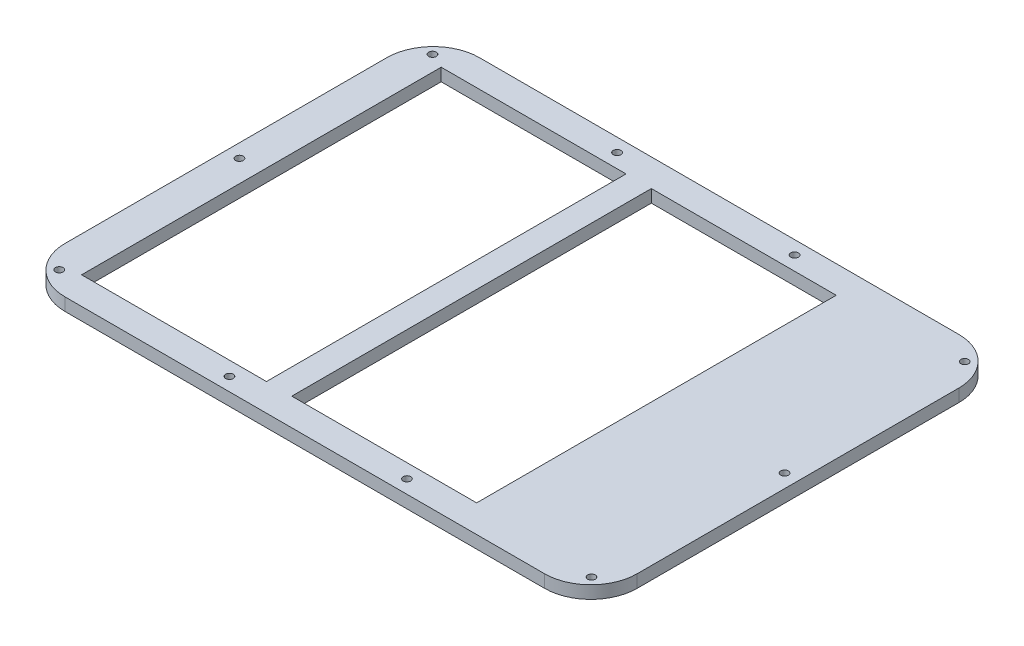
ISO-10303-21;
HEADER;
FILE_DESCRIPTION(('STEP AP214'),'2;1');
FILE_NAME('part.step','',(''),(''),'','','');
FILE_SCHEMA(('AUTOMOTIVE_DESIGN { 1 0 10303 214 1 1 1 1 }'));
ENDSEC;
DATA;
#1=APPLICATION_CONTEXT('core data for automotive mechanical design processes');
#2=APPLICATION_PROTOCOL_DEFINITION('international standard','automotive_design',2000,#1);
#3=PRODUCT_CONTEXT('',#1,'mechanical');
#4=PRODUCT('Part','Part','',(#3));
#5=PRODUCT_RELATED_PRODUCT_CATEGORY('part','',(#4));
#6=PRODUCT_DEFINITION_FORMATION('','',#4);
#7=PRODUCT_DEFINITION_CONTEXT('part definition',#1,'design');
#8=PRODUCT_DEFINITION('design','',#6,#7);
#9=PRODUCT_DEFINITION_SHAPE('','',#8);
#10=(LENGTH_UNIT() NAMED_UNIT(*) SI_UNIT(.MILLI.,.METRE.));
#11=(NAMED_UNIT(*) PLANE_ANGLE_UNIT() SI_UNIT($,.RADIAN.));
#12=(NAMED_UNIT(*) SI_UNIT($,.STERADIAN.) SOLID_ANGLE_UNIT());
#13=UNCERTAINTY_MEASURE_WITH_UNIT(LENGTH_MEASURE(1.E-05),#10,'distance_accuracy_value','');
#14=(GEOMETRIC_REPRESENTATION_CONTEXT(3) GLOBAL_UNCERTAINTY_ASSIGNED_CONTEXT((#13)) GLOBAL_UNIT_ASSIGNED_CONTEXT((#10,
#11,#12)) REPRESENTATION_CONTEXT('',''));
#15=CARTESIAN_POINT('',(0.,0.,0.));
#16=DIRECTION('',(0.,0.,1.));
#17=DIRECTION('',(1.,0.,0.));
#18=AXIS2_PLACEMENT_3D('',#15,#16,#17);
#19=CARTESIAN_POINT('',(0.,5.,0.));
#20=DIRECTION('',(0.,-1.,0.));
#21=DIRECTION('',(0.,0.,-1.));
#22=AXIS2_PLACEMENT_3D('',#19,#20,#21);
#23=PLANE('',#22);
#24=DIRECTION('',(0.,0.,1.));
#25=VECTOR('',#24,1.);
#26=CARTESIAN_POINT('',(-98.97031,5.,71.));
#27=LINE('',#26,#25);
#28=CARTESIAN_POINT('',(-98.97031,5.,-71.));
#29=VERTEX_POINT('',#28);
#30=CARTESIAN_POINT('',(-98.97031,5.,71.));
#31=VERTEX_POINT('',#30);
#32=EDGE_CURVE('E194',#29,#31,#27,.T.);
#33=ORIENTED_EDGE('',*,*,#32,.F.);
#34=DIRECTION('',(-1.,0.,0.));
#35=VECTOR('',#34,1.);
#36=CARTESIAN_POINT('',(-98.97031,5.,-71.));
#37=LINE('',#36,#35);
#38=CARTESIAN_POINT('',(-25.97031,5.,-71.));
#39=VERTEX_POINT('',#38);
#40=EDGE_CURVE('E202',#39,#29,#37,.T.);
#41=ORIENTED_EDGE('',*,*,#40,.F.);
#42=DIRECTION('',(0.,0.,-1.));
#43=VECTOR('',#42,1.);
#44=CARTESIAN_POINT('',(-25.97031,5.,-71.));
#45=LINE('',#44,#43);
#46=CARTESIAN_POINT('',(-25.97031,5.,71.));
#47=VERTEX_POINT('',#46);
#48=EDGE_CURVE('E199',#47,#39,#45,.T.);
#49=ORIENTED_EDGE('',*,*,#48,.F.);
#50=DIRECTION('',(1.,0.,0.));
#51=VECTOR('',#50,1.);
#52=CARTESIAN_POINT('',(-25.97031,5.,71.));
#53=LINE('',#52,#51);
#54=EDGE_CURVE('E196',#31,#47,#53,.T.);
#55=ORIENTED_EDGE('',*,*,#54,.F.);
#56=EDGE_LOOP('',(#33,#41,#49,#55));
#57=FACE_BOUND('',#56,.T.);
#58=DIRECTION('',(1.,0.,0.));
#59=VECTOR('',#58,1.);
#60=CARTESIAN_POINT('',(112.97031,5.,81.8261));
#61=LINE('',#60,#59);
#62=CARTESIAN_POINT('',(-94.67031,5.,81.8261));
#63=VERTEX_POINT('',#62);
#64=CARTESIAN_POINT('',(94.67031,5.,81.8261));
#65=VERTEX_POINT('',#64);
#66=EDGE_CURVE('E288',#63,#65,#61,.T.);
#67=ORIENTED_EDGE('',*,*,#66,.T.);
#68=CARTESIAN_POINT('',(94.67031,5.,63.5261));
#69=DIRECTION('',(0.,-1.,0.));
#70=DIRECTION('',(0.,0.,-1.));
#71=AXIS2_PLACEMENT_3D('',#68,#69,#70);
#72=CIRCLE('',#71,18.3);
#73=CARTESIAN_POINT('',(112.97031,5.,63.5261));
#74=VERTEX_POINT('',#73);
#75=EDGE_CURVE('E328',#65,#74,#72,.F.);
#76=ORIENTED_EDGE('',*,*,#75,.T.);
#77=DIRECTION('',(0.,0.,-1.));
#78=VECTOR('',#77,1.);
#79=CARTESIAN_POINT('',(112.97031,5.,-81.8261));
#80=LINE('',#79,#78);
#81=CARTESIAN_POINT('',(112.97031,5.,-63.5261));
#82=VERTEX_POINT('',#81);
#83=EDGE_CURVE('E292',#74,#82,#80,.T.);
#84=ORIENTED_EDGE('',*,*,#83,.T.);
#85=CARTESIAN_POINT('',(94.67031,5.,-63.5261));
#86=DIRECTION('',(0.,-1.,0.));
#87=DIRECTION('',(0.,0.,-1.));
#88=AXIS2_PLACEMENT_3D('',#85,#86,#87);
#89=CIRCLE('',#88,18.3);
#90=CARTESIAN_POINT('',(94.67031,5.,-81.8261));
#91=VERTEX_POINT('',#90);
#92=EDGE_CURVE('E59',#82,#91,#89,.F.);
#93=ORIENTED_EDGE('',*,*,#92,.T.);
#94=DIRECTION('',(-1.,0.,0.));
#95=VECTOR('',#94,1.);
#96=CARTESIAN_POINT('',(-112.97031,5.,-81.8261));
#97=LINE('',#96,#95);
#98=CARTESIAN_POINT('',(-94.67031,5.,-81.8261));
#99=VERTEX_POINT('',#98);
#100=EDGE_CURVE('E294',#91,#99,#97,.T.);
#101=ORIENTED_EDGE('',*,*,#100,.T.);
#102=CARTESIAN_POINT('',(-94.67031,5.,-63.5261));
#103=DIRECTION('',(0.,-1.,0.));
#104=DIRECTION('',(0.,0.,-1.));
#105=AXIS2_PLACEMENT_3D('',#102,#103,#104);
#106=CIRCLE('',#105,18.3);
#107=CARTESIAN_POINT('',(-112.97031,5.,-63.5261));
#108=VERTEX_POINT('',#107);
#109=EDGE_CURVE('E324',#99,#108,#106,.F.);
#110=ORIENTED_EDGE('',*,*,#109,.T.);
#111=DIRECTION('',(0.,0.,1.));
#112=VECTOR('',#111,1.);
#113=CARTESIAN_POINT('',(-112.97031,5.,81.8261));
#114=LINE('',#113,#112);
#115=CARTESIAN_POINT('',(-112.97031,5.,63.5261));
#116=VERTEX_POINT('',#115);
#117=EDGE_CURVE('E285',#108,#116,#114,.T.);
#118=ORIENTED_EDGE('',*,*,#117,.T.);
#119=CARTESIAN_POINT('',(-94.67031,5.,63.5261));
#120=DIRECTION('',(0.,-1.,0.));
#121=DIRECTION('',(0.,0.,-1.));
#122=AXIS2_PLACEMENT_3D('',#119,#120,#121);
#123=CIRCLE('',#122,18.3);
#124=EDGE_CURVE('E326',#116,#63,#123,.F.);
#125=ORIENTED_EDGE('',*,*,#124,.T.);
#126=EDGE_LOOP('',(#67,#76,#84,#93,#101,#110,#118,#125));
#127=FACE_BOUND('',#126,.T.);
#128=CARTESIAN_POINT('',(107.63631,5.,0.));
#129=DIRECTION('',(0.,1.,0.));
#130=DIRECTION('',(0.,0.,-1.));
#131=AXIS2_PLACEMENT_3D('',#128,#129,#130);
#132=CIRCLE('',#131,1.5);
#133=CARTESIAN_POINT('',(107.63631,5.,-1.50000000000008));
#134=VERTEX_POINT('',#133);
#135=EDGE_CURVE('E279',#134,#134,#132,.T.);
#136=ORIENTED_EDGE('',*,*,#135,.F.);
#137=EDGE_LOOP('',(#136));
#138=FACE_BOUND('',#137,.T.);
#139=CARTESIAN_POINT('',(35.04311,5.,-76.5429));
#140=DIRECTION('',(0.,1.,0.));
#141=DIRECTION('',(0.,0.,-1.));
#142=AXIS2_PLACEMENT_3D('',#139,#140,#141);
#143=CIRCLE('',#142,1.5);
#144=CARTESIAN_POINT('',(35.04311,5.,-78.0429));
#145=VERTEX_POINT('',#144);
#146=EDGE_CURVE('E273',#145,#145,#143,.T.);
#147=ORIENTED_EDGE('',*,*,#146,.F.);
#148=EDGE_LOOP('',(#147));
#149=FACE_BOUND('',#148,.T.);
#150=CARTESIAN_POINT('',(-105.09631,5.,-73.6981));
#151=DIRECTION('',(0.,1.,0.));
#152=DIRECTION('',(0.,0.,1.));
#153=AXIS2_PLACEMENT_3D('',#150,#151,#152);
#154=CIRCLE('',#153,1.5);
#155=CARTESIAN_POINT('',(-105.09631,5.,-72.1981));
#156=VERTEX_POINT('',#155);
#157=EDGE_CURVE('E267',#156,#156,#154,.T.);
#158=ORIENTED_EDGE('',*,*,#157,.F.);
#159=EDGE_LOOP('',(#158));
#160=FACE_BOUND('',#159,.T.);
#161=CARTESIAN_POINT('',(-35.04311,5.,-76.5429));
#162=DIRECTION('',(0.,1.,0.));
#163=DIRECTION('',(0.,0.,1.));
#164=AXIS2_PLACEMENT_3D('',#161,#162,#163);
#165=CIRCLE('',#164,1.5);
#166=CARTESIAN_POINT('',(-35.04311,5.,-75.0429));
#167=VERTEX_POINT('',#166);
#168=EDGE_CURVE('E261',#167,#167,#165,.T.);
#169=ORIENTED_EDGE('',*,*,#168,.F.);
#170=EDGE_LOOP('',(#169));
#171=FACE_BOUND('',#170,.T.);
#172=CARTESIAN_POINT('',(105.09631,5.,-73.6981));
#173=DIRECTION('',(0.,1.,0.));
#174=DIRECTION('',(0.,0.,-1.));
#175=AXIS2_PLACEMENT_3D('',#172,#173,#174);
#176=CIRCLE('',#175,1.49999999999999);
#177=CARTESIAN_POINT('',(105.09631,5.,-75.1981));
#178=VERTEX_POINT('',#177);
#179=EDGE_CURVE('E255',#178,#178,#176,.T.);
#180=ORIENTED_EDGE('',*,*,#179,.F.);
#181=EDGE_LOOP('',(#180));
#182=FACE_BOUND('',#181,.T.);
#183=CARTESIAN_POINT('',(105.09631,5.,73.6981));
#184=DIRECTION('',(0.,1.,0.));
#185=DIRECTION('',(0.,0.,1.));
#186=AXIS2_PLACEMENT_3D('',#183,#184,#185);
#187=CIRCLE('',#186,1.49999999999999);
#188=CARTESIAN_POINT('',(105.09631,5.,75.1981));
#189=VERTEX_POINT('',#188);
#190=EDGE_CURVE('E249',#189,#189,#187,.T.);
#191=ORIENTED_EDGE('',*,*,#190,.F.);
#192=EDGE_LOOP('',(#191));
#193=FACE_BOUND('',#192,.T.);
#194=CARTESIAN_POINT('',(35.04311,5.,76.5429));
#195=DIRECTION('',(0.,1.,0.));
#196=DIRECTION('',(0.,0.,1.));
#197=AXIS2_PLACEMENT_3D('',#194,#195,#196);
#198=CIRCLE('',#197,1.5);
#199=CARTESIAN_POINT('',(35.04311,5.,78.0429));
#200=VERTEX_POINT('',#199);
#201=EDGE_CURVE('E243',#200,#200,#198,.T.);
#202=ORIENTED_EDGE('',*,*,#201,.F.);
#203=EDGE_LOOP('',(#202));
#204=FACE_BOUND('',#203,.T.);
#205=CARTESIAN_POINT('',(-107.63631,5.,0.));
#206=DIRECTION('',(0.,1.,0.));
#207=DIRECTION('',(0.,0.,1.));
#208=AXIS2_PLACEMENT_3D('',#205,#206,#207);
#209=CIRCLE('',#208,1.5);
#210=CARTESIAN_POINT('',(-107.63631,5.,1.5));
#211=VERTEX_POINT('',#210);
#212=EDGE_CURVE('E237',#211,#211,#209,.T.);
#213=ORIENTED_EDGE('',*,*,#212,.F.);
#214=EDGE_LOOP('',(#213));
#215=FACE_BOUND('',#214,.T.);
#216=CARTESIAN_POINT('',(-35.04311,5.,76.5429));
#217=DIRECTION('',(0.,1.,0.));
#218=DIRECTION('',(0.,0.,-1.));
#219=AXIS2_PLACEMENT_3D('',#216,#217,#218);
#220=CIRCLE('',#219,1.5);
#221=CARTESIAN_POINT('',(-35.04311,5.,75.0429));
#222=VERTEX_POINT('',#221);
#223=EDGE_CURVE('E231',#222,#222,#220,.T.);
#224=ORIENTED_EDGE('',*,*,#223,.F.);
#225=EDGE_LOOP('',(#224));
#226=FACE_BOUND('',#225,.T.);
#227=CARTESIAN_POINT('',(-105.09631,5.,73.6981000000001));
#228=DIRECTION('',(0.,1.,0.));
#229=DIRECTION('',(0.,0.,-1.));
#230=AXIS2_PLACEMENT_3D('',#227,#228,#229);
#231=CIRCLE('',#230,1.5);
#232=CARTESIAN_POINT('',(-105.09631,5.,72.1981000000001));
#233=VERTEX_POINT('',#232);
#234=EDGE_CURVE('E225',#233,#233,#231,.T.);
#235=ORIENTED_EDGE('',*,*,#234,.F.);
#236=EDGE_LOOP('',(#235));
#237=FACE_BOUND('',#236,.T.);
#238=DIRECTION('',(-1.,0.,0.));
#239=VECTOR('',#238,1.);
#240=CARTESIAN_POINT('',(-15.97031,5.,-71.));
#241=LINE('',#240,#239);
#242=CARTESIAN_POINT('',(57.02969,5.,-71.));
#243=VERTEX_POINT('',#242);
#244=CARTESIAN_POINT('',(-15.97031,5.,-71.));
#245=VERTEX_POINT('',#244);
#246=EDGE_CURVE('E153',#243,#245,#241,.T.);
#247=ORIENTED_EDGE('',*,*,#246,.F.);
#248=DIRECTION('',(0.,0.,-1.));
#249=VECTOR('',#248,1.);
#250=CARTESIAN_POINT('',(57.02969,5.,-71.));
#251=LINE('',#250,#249);
#252=CARTESIAN_POINT('',(57.02969,5.,71.));
#253=VERTEX_POINT('',#252);
#254=EDGE_CURVE('E178',#253,#243,#251,.T.);
#255=ORIENTED_EDGE('',*,*,#254,.F.);
#256=DIRECTION('',(1.,0.,0.));
#257=VECTOR('',#256,1.);
#258=CARTESIAN_POINT('',(57.02969,5.,71.));
#259=LINE('',#258,#257);
#260=CARTESIAN_POINT('',(-15.97031,5.,71.));
#261=VERTEX_POINT('',#260);
#262=EDGE_CURVE('E176',#261,#253,#259,.T.);
#263=ORIENTED_EDGE('',*,*,#262,.F.);
#264=DIRECTION('',(0.,0.,1.));
#265=VECTOR('',#264,1.);
#266=CARTESIAN_POINT('',(-15.97031,5.,71.));
#267=LINE('',#266,#265);
#268=EDGE_CURVE('E163',#245,#261,#267,.T.);
#269=ORIENTED_EDGE('',*,*,#268,.F.);
#270=EDGE_LOOP('',(#247,#255,#263,#269));
#271=FACE_BOUND('',#270,.T.);
#272=ADVANCED_FACE('F39',(#57,#127,#138,#149,#160,#171,#182,#193,#204,#215,#226,#237,#271),#23,.F.);
#273=CARTESIAN_POINT('',(0.,0.,0.));
#274=DIRECTION('',(0.,-1.,0.));
#275=DIRECTION('',(0.,0.,-1.));
#276=AXIS2_PLACEMENT_3D('',#273,#274,#275);
#277=PLANE('',#276);
#278=CARTESIAN_POINT('',(-35.04311,0.,76.5429));
#279=DIRECTION('',(0.,1.,0.));
#280=DIRECTION('',(0.,0.,-1.));
#281=AXIS2_PLACEMENT_3D('',#278,#279,#280);
#282=CIRCLE('',#281,1.5);
#283=CARTESIAN_POINT('',(-35.04311,0.,75.0429));
#284=VERTEX_POINT('',#283);
#285=EDGE_CURVE('E228',#284,#284,#282,.T.);
#286=ORIENTED_EDGE('',*,*,#285,.T.);
#287=EDGE_LOOP('',(#286));
#288=FACE_BOUND('',#287,.T.);
#289=CARTESIAN_POINT('',(35.04311,0.,76.5429));
#290=DIRECTION('',(0.,1.,0.));
#291=DIRECTION('',(0.,0.,1.));
#292=AXIS2_PLACEMENT_3D('',#289,#290,#291);
#293=CIRCLE('',#292,1.5);
#294=CARTESIAN_POINT('',(35.04311,0.,78.0429));
#295=VERTEX_POINT('',#294);
#296=EDGE_CURVE('E240',#295,#295,#293,.T.);
#297=ORIENTED_EDGE('',*,*,#296,.T.);
#298=EDGE_LOOP('',(#297));
#299=FACE_BOUND('',#298,.T.);
#300=CARTESIAN_POINT('',(105.09631,0.,-73.6981));
#301=DIRECTION('',(0.,1.,0.));
#302=DIRECTION('',(0.,0.,-1.));
#303=AXIS2_PLACEMENT_3D('',#300,#301,#302);
#304=CIRCLE('',#303,1.49999999999999);
#305=CARTESIAN_POINT('',(105.09631,0.,-75.1981));
#306=VERTEX_POINT('',#305);
#307=EDGE_CURVE('E252',#306,#306,#304,.T.);
#308=ORIENTED_EDGE('',*,*,#307,.T.);
#309=EDGE_LOOP('',(#308));
#310=FACE_BOUND('',#309,.T.);
#311=CARTESIAN_POINT('',(-105.09631,0.,-73.6981));
#312=DIRECTION('',(0.,1.,0.));
#313=DIRECTION('',(0.,0.,1.));
#314=AXIS2_PLACEMENT_3D('',#311,#312,#313);
#315=CIRCLE('',#314,1.5);
#316=CARTESIAN_POINT('',(-105.09631,0.,-72.1981));
#317=VERTEX_POINT('',#316);
#318=EDGE_CURVE('E264',#317,#317,#315,.T.);
#319=ORIENTED_EDGE('',*,*,#318,.T.);
#320=EDGE_LOOP('',(#319));
#321=FACE_BOUND('',#320,.T.);
#322=CARTESIAN_POINT('',(107.63631,0.,0.));
#323=DIRECTION('',(0.,1.,0.));
#324=DIRECTION('',(0.,0.,-1.));
#325=AXIS2_PLACEMENT_3D('',#322,#323,#324);
#326=CIRCLE('',#325,1.5);
#327=CARTESIAN_POINT('',(107.63631,0.,-1.50000000000008));
#328=VERTEX_POINT('',#327);
#329=EDGE_CURVE('E276',#328,#328,#326,.T.);
#330=ORIENTED_EDGE('',*,*,#329,.T.);
#331=EDGE_LOOP('',(#330));
#332=FACE_BOUND('',#331,.T.);
#333=DIRECTION('',(0.,0.,-1.));
#334=VECTOR('',#333,1.);
#335=CARTESIAN_POINT('',(112.97031,0.,-81.8261));
#336=LINE('',#335,#334);
#337=CARTESIAN_POINT('',(112.97031,0.,63.5261));
#338=VERTEX_POINT('',#337);
#339=CARTESIAN_POINT('',(112.97031,0.,-63.5261));
#340=VERTEX_POINT('',#339);
#341=EDGE_CURVE('E302',#338,#340,#336,.T.);
#342=ORIENTED_EDGE('',*,*,#341,.F.);
#343=CARTESIAN_POINT('',(94.67031,0.,63.5261));
#344=DIRECTION('',(0.,-1.,0.));
#345=DIRECTION('',(0.,0.,-1.));
#346=AXIS2_PLACEMENT_3D('',#343,#344,#345);
#347=CIRCLE('',#346,18.3);
#348=CARTESIAN_POINT('',(94.67031,0.,81.8261));
#349=VERTEX_POINT('',#348);
#350=EDGE_CURVE('E316',#338,#349,#347,.T.);
#351=ORIENTED_EDGE('',*,*,#350,.T.);
#352=DIRECTION('',(1.,0.,0.));
#353=VECTOR('',#352,1.);
#354=CARTESIAN_POINT('',(112.97031,0.,81.8261));
#355=LINE('',#354,#353);
#356=CARTESIAN_POINT('',(-94.67031,0.,81.8261));
#357=VERTEX_POINT('',#356);
#358=EDGE_CURVE('E299',#357,#349,#355,.T.);
#359=ORIENTED_EDGE('',*,*,#358,.F.);
#360=CARTESIAN_POINT('',(-94.67031,0.,63.5261));
#361=DIRECTION('',(0.,-1.,0.));
#362=DIRECTION('',(0.,0.,-1.));
#363=AXIS2_PLACEMENT_3D('',#360,#361,#362);
#364=CIRCLE('',#363,18.3);
#365=CARTESIAN_POINT('',(-112.97031,0.,63.5261));
#366=VERTEX_POINT('',#365);
#367=EDGE_CURVE('E314',#357,#366,#364,.T.);
#368=ORIENTED_EDGE('',*,*,#367,.T.);
#369=DIRECTION('',(0.,0.,1.));
#370=VECTOR('',#369,1.);
#371=CARTESIAN_POINT('',(-112.97031,0.,81.8261));
#372=LINE('',#371,#370);
#373=CARTESIAN_POINT('',(-112.97031,0.,-63.5261));
#374=VERTEX_POINT('',#373);
#375=EDGE_CURVE('E282',#374,#366,#372,.T.);
#376=ORIENTED_EDGE('',*,*,#375,.F.);
#377=CARTESIAN_POINT('',(-94.67031,0.,-63.5261));
#378=DIRECTION('',(0.,-1.,0.));
#379=DIRECTION('',(0.,0.,-1.));
#380=AXIS2_PLACEMENT_3D('',#377,#378,#379);
#381=CIRCLE('',#380,18.3);
#382=CARTESIAN_POINT('',(-94.67031,0.,-81.8261));
#383=VERTEX_POINT('',#382);
#384=EDGE_CURVE('E312',#374,#383,#381,.T.);
#385=ORIENTED_EDGE('',*,*,#384,.T.);
#386=DIRECTION('',(-1.,0.,0.));
#387=VECTOR('',#386,1.);
#388=CARTESIAN_POINT('',(-112.97031,0.,-81.8261));
#389=LINE('',#388,#387);
#390=CARTESIAN_POINT('',(94.67031,0.,-81.8261));
#391=VERTEX_POINT('',#390);
#392=EDGE_CURVE('E289',#391,#383,#389,.T.);
#393=ORIENTED_EDGE('',*,*,#392,.F.);
#394=CARTESIAN_POINT('',(94.67031,0.,-63.5261));
#395=DIRECTION('',(0.,-1.,0.));
#396=DIRECTION('',(0.,0.,-1.));
#397=AXIS2_PLACEMENT_3D('',#394,#395,#396);
#398=CIRCLE('',#397,18.3);
#399=EDGE_CURVE('E310',#391,#340,#398,.T.);
#400=ORIENTED_EDGE('',*,*,#399,.T.);
#401=EDGE_LOOP('',(#342,#351,#359,#368,#376,#385,#393,#400));
#402=FACE_BOUND('',#401,.T.);
#403=CARTESIAN_POINT('',(35.04311,0.,-76.5429));
#404=DIRECTION('',(0.,1.,0.));
#405=DIRECTION('',(0.,0.,-1.));
#406=AXIS2_PLACEMENT_3D('',#403,#404,#405);
#407=CIRCLE('',#406,1.5);
#408=CARTESIAN_POINT('',(35.04311,0.,-78.0429));
#409=VERTEX_POINT('',#408);
#410=EDGE_CURVE('E270',#409,#409,#407,.T.);
#411=ORIENTED_EDGE('',*,*,#410,.T.);
#412=EDGE_LOOP('',(#411));
#413=FACE_BOUND('',#412,.T.);
#414=CARTESIAN_POINT('',(-35.04311,0.,-76.5429));
#415=DIRECTION('',(0.,1.,0.));
#416=DIRECTION('',(0.,0.,1.));
#417=AXIS2_PLACEMENT_3D('',#414,#415,#416);
#418=CIRCLE('',#417,1.5);
#419=CARTESIAN_POINT('',(-35.04311,0.,-75.0429));
#420=VERTEX_POINT('',#419);
#421=EDGE_CURVE('E258',#420,#420,#418,.T.);
#422=ORIENTED_EDGE('',*,*,#421,.T.);
#423=EDGE_LOOP('',(#422));
#424=FACE_BOUND('',#423,.T.);
#425=CARTESIAN_POINT('',(105.09631,0.,73.6981));
#426=DIRECTION('',(0.,1.,0.));
#427=DIRECTION('',(0.,0.,1.));
#428=AXIS2_PLACEMENT_3D('',#425,#426,#427);
#429=CIRCLE('',#428,1.49999999999999);
#430=CARTESIAN_POINT('',(105.09631,0.,75.1981));
#431=VERTEX_POINT('',#430);
#432=EDGE_CURVE('E246',#431,#431,#429,.T.);
#433=ORIENTED_EDGE('',*,*,#432,.T.);
#434=EDGE_LOOP('',(#433));
#435=FACE_BOUND('',#434,.T.);
#436=CARTESIAN_POINT('',(-107.63631,0.,0.));
#437=DIRECTION('',(0.,1.,0.));
#438=DIRECTION('',(0.,0.,1.));
#439=AXIS2_PLACEMENT_3D('',#436,#437,#438);
#440=CIRCLE('',#439,1.5);
#441=CARTESIAN_POINT('',(-107.63631,0.,1.5));
#442=VERTEX_POINT('',#441);
#443=EDGE_CURVE('E234',#442,#442,#440,.T.);
#444=ORIENTED_EDGE('',*,*,#443,.T.);
#445=EDGE_LOOP('',(#444));
#446=FACE_BOUND('',#445,.T.);
#447=CARTESIAN_POINT('',(-105.09631,0.,73.6981000000001));
#448=DIRECTION('',(0.,1.,0.));
#449=DIRECTION('',(0.,0.,-1.));
#450=AXIS2_PLACEMENT_3D('',#447,#448,#449);
#451=CIRCLE('',#450,1.5);
#452=CARTESIAN_POINT('',(-105.09631,0.,72.1981000000001));
#453=VERTEX_POINT('',#452);
#454=EDGE_CURVE('E224',#453,#453,#451,.T.);
#455=ORIENTED_EDGE('',*,*,#454,.T.);
#456=EDGE_LOOP('',(#455));
#457=FACE_BOUND('',#456,.T.);
#458=DIRECTION('',(-1.,0.,0.));
#459=VECTOR('',#458,1.);
#460=CARTESIAN_POINT('',(-98.97031,0.,-71.));
#461=LINE('',#460,#459);
#462=CARTESIAN_POINT('',(-25.97031,0.,-71.));
#463=VERTEX_POINT('',#462);
#464=CARTESIAN_POINT('',(-98.97031,0.,-71.));
#465=VERTEX_POINT('',#464);
#466=EDGE_CURVE('E197',#463,#465,#461,.T.);
#467=ORIENTED_EDGE('',*,*,#466,.T.);
#468=DIRECTION('',(0.,0.,1.));
#469=VECTOR('',#468,1.);
#470=CARTESIAN_POINT('',(-98.97031,0.,71.));
#471=LINE('',#470,#469);
#472=CARTESIAN_POINT('',(-98.97031,0.,71.));
#473=VERTEX_POINT('',#472);
#474=EDGE_CURVE('E171',#465,#473,#471,.T.);
#475=ORIENTED_EDGE('',*,*,#474,.T.);
#476=DIRECTION('',(1.,0.,0.));
#477=VECTOR('',#476,1.);
#478=CARTESIAN_POINT('',(-25.97031,0.,71.));
#479=LINE('',#478,#477);
#480=CARTESIAN_POINT('',(-25.97031,0.,71.));
#481=VERTEX_POINT('',#480);
#482=EDGE_CURVE('E207',#473,#481,#479,.T.);
#483=ORIENTED_EDGE('',*,*,#482,.T.);
#484=DIRECTION('',(0.,0.,-1.));
#485=VECTOR('',#484,1.);
#486=CARTESIAN_POINT('',(-25.97031,0.,-71.));
#487=LINE('',#486,#485);
#488=EDGE_CURVE('E210',#481,#463,#487,.T.);
#489=ORIENTED_EDGE('',*,*,#488,.T.);
#490=EDGE_LOOP('',(#467,#475,#483,#489));
#491=FACE_BOUND('',#490,.T.);
#492=DIRECTION('',(0.,0.,-1.));
#493=VECTOR('',#492,1.);
#494=CARTESIAN_POINT('',(57.02969,0.,-71.));
#495=LINE('',#494,#493);
#496=CARTESIAN_POINT('',(57.02969,0.,71.));
#497=VERTEX_POINT('',#496);
#498=CARTESIAN_POINT('',(57.02969,0.,-71.));
#499=VERTEX_POINT('',#498);
#500=EDGE_CURVE('E164',#497,#499,#495,.T.);
#501=ORIENTED_EDGE('',*,*,#500,.T.);
#502=DIRECTION('',(-1.,0.,0.));
#503=VECTOR('',#502,1.);
#504=CARTESIAN_POINT('',(-15.97031,0.,-71.));
#505=LINE('',#504,#503);
#506=CARTESIAN_POINT('',(-15.97031,0.,-71.));
#507=VERTEX_POINT('',#506);
#508=EDGE_CURVE('E182',#499,#507,#505,.T.);
#509=ORIENTED_EDGE('',*,*,#508,.T.);
#510=DIRECTION('',(0.,0.,1.));
#511=VECTOR('',#510,1.);
#512=CARTESIAN_POINT('',(-15.97031,0.,71.));
#513=LINE('',#512,#511);
#514=CARTESIAN_POINT('',(-15.97031,0.,71.));
#515=VERTEX_POINT('',#514);
#516=EDGE_CURVE('E170',#507,#515,#513,.T.);
#517=ORIENTED_EDGE('',*,*,#516,.T.);
#518=DIRECTION('',(1.,0.,0.));
#519=VECTOR('',#518,1.);
#520=CARTESIAN_POINT('',(57.02969,0.,71.));
#521=LINE('',#520,#519);
#522=EDGE_CURVE('E185',#515,#497,#521,.T.);
#523=ORIENTED_EDGE('',*,*,#522,.T.);
#524=EDGE_LOOP('',(#501,#509,#517,#523));
#525=FACE_BOUND('',#524,.T.);
#526=ADVANCED_FACE('F341',(#288,#299,#310,#321,#332,#402,#413,#424,#435,#446,#457,#491,#525),
#277,.T.);
#527=CARTESIAN_POINT('',(-112.97031,5.,81.8261));
#528=DIRECTION('',(1.,0.,0.));
#529=DIRECTION('',(0.,0.,-1.));
#530=AXIS2_PLACEMENT_3D('',#527,#528,#529);
#531=PLANE('',#530);
#532=ORIENTED_EDGE('',*,*,#375,.T.);
#533=DIRECTION('',(0.,-1.,0.));
#534=VECTOR('',#533,1.);
#535=CARTESIAN_POINT('',(-112.97031,5.,63.5261));
#536=LINE('',#535,#534);
#537=EDGE_CURVE('E333',#366,#116,#536,.F.);
#538=ORIENTED_EDGE('',*,*,#537,.T.);
#539=ORIENTED_EDGE('',*,*,#117,.F.);
#540=DIRECTION('',(0.,-1.,0.));
#541=VECTOR('',#540,1.);
#542=CARTESIAN_POINT('',(-112.97031,5.,-63.5261));
#543=LINE('',#542,#541);
#544=EDGE_CURVE('E330',#108,#374,#543,.T.);
#545=ORIENTED_EDGE('',*,*,#544,.T.);
#546=EDGE_LOOP('',(#532,#538,#539,#545));
#547=FACE_BOUND('',#546,.T.);
#548=ADVANCED_FACE('F350',(#547),#531,.F.);
#549=CARTESIAN_POINT('',(112.97031,5.,81.8261));
#550=DIRECTION('',(0.,0.,-1.));
#551=DIRECTION('',(-1.,0.,0.));
#552=AXIS2_PLACEMENT_3D('',#549,#550,#551);
#553=PLANE('',#552);
#554=ORIENTED_EDGE('',*,*,#358,.T.);
#555=DIRECTION('',(0.,-1.,0.));
#556=VECTOR('',#555,1.);
#557=CARTESIAN_POINT('',(94.67031,5.,81.8261));
#558=LINE('',#557,#556);
#559=EDGE_CURVE('E321',#349,#65,#558,.F.);
#560=ORIENTED_EDGE('',*,*,#559,.T.);
#561=ORIENTED_EDGE('',*,*,#66,.F.);
#562=DIRECTION('',(0.,-1.,0.));
#563=VECTOR('',#562,1.);
#564=CARTESIAN_POINT('',(-94.67031,5.,81.8261));
#565=LINE('',#564,#563);
#566=EDGE_CURVE('E318',#63,#357,#565,.T.);
#567=ORIENTED_EDGE('',*,*,#566,.T.);
#568=EDGE_LOOP('',(#554,#560,#561,#567));
#569=FACE_BOUND('',#568,.T.);
#570=ADVANCED_FACE('F360',(#569),#553,.F.);
#571=CARTESIAN_POINT('',(112.97031,5.,-81.8261));
#572=DIRECTION('',(-1.,0.,0.));
#573=DIRECTION('',(0.,0.,1.));
#574=AXIS2_PLACEMENT_3D('',#571,#572,#573);
#575=PLANE('',#574);
#576=ORIENTED_EDGE('',*,*,#83,.F.);
#577=DIRECTION('',(0.,-1.,0.));
#578=VECTOR('',#577,1.);
#579=CARTESIAN_POINT('',(112.97031,5.,63.5261));
#580=LINE('',#579,#578);
#581=EDGE_CURVE('E307',#74,#338,#580,.T.);
#582=ORIENTED_EDGE('',*,*,#581,.T.);
#583=ORIENTED_EDGE('',*,*,#341,.T.);
#584=DIRECTION('',(0.,-1.,0.));
#585=VECTOR('',#584,1.);
#586=CARTESIAN_POINT('',(112.97031,5.,-63.5261));
#587=LINE('',#586,#585);
#588=EDGE_CURVE('E296',#340,#82,#587,.F.);
#589=ORIENTED_EDGE('',*,*,#588,.T.);
#590=EDGE_LOOP('',(#576,#582,#583,#589));
#591=FACE_BOUND('',#590,.T.);
#592=ADVANCED_FACE('F368',(#591),#575,.F.);
#593=CARTESIAN_POINT('',(-112.97031,5.,-81.8261));
#594=DIRECTION('',(0.,0.,1.));
#595=DIRECTION('',(1.,0.,0.));
#596=AXIS2_PLACEMENT_3D('',#593,#594,#595);
#597=PLANE('',#596);
#598=ORIENTED_EDGE('',*,*,#392,.T.);
#599=DIRECTION('',(0.,-1.,0.));
#600=VECTOR('',#599,1.);
#601=CARTESIAN_POINT('',(-94.67031,5.,-81.8261));
#602=LINE('',#601,#600);
#603=EDGE_CURVE('E11',#383,#99,#602,.F.);
#604=ORIENTED_EDGE('',*,*,#603,.T.);
#605=ORIENTED_EDGE('',*,*,#100,.F.);
#606=DIRECTION('',(0.,-1.,0.));
#607=VECTOR('',#606,1.);
#608=CARTESIAN_POINT('',(94.67031,5.,-81.8261));
#609=LINE('',#608,#607);
#610=EDGE_CURVE('E47',#91,#391,#609,.T.);
#611=ORIENTED_EDGE('',*,*,#610,.T.);
#612=EDGE_LOOP('',(#598,#604,#605,#611));
#613=FACE_BOUND('',#612,.T.);
#614=ADVANCED_FACE('F337',(#613),#597,.F.);
#615=CARTESIAN_POINT('',(107.63631,5.,0.));
#616=DIRECTION('',(0.,-1.,0.));
#617=DIRECTION('',(0.,0.,-1.));
#618=AXIS2_PLACEMENT_3D('',#615,#616,#617);
#619=CYLINDRICAL_SURFACE('',#618,1.5);
#620=ORIENTED_EDGE('',*,*,#135,.T.);
#621=EDGE_LOOP('',(#620));
#622=FACE_BOUND('',#621,.T.);
#623=ORIENTED_EDGE('',*,*,#329,.F.);
#624=EDGE_LOOP('',(#623));
#625=FACE_BOUND('',#624,.T.);
#626=ADVANCED_FACE('F385',(#622,#625),#619,.F.);
#627=CARTESIAN_POINT('',(35.04311,5.,-76.5429));
#628=DIRECTION('',(0.,-1.,0.));
#629=DIRECTION('',(0.,0.,-1.));
#630=AXIS2_PLACEMENT_3D('',#627,#628,#629);
#631=CYLINDRICAL_SURFACE('',#630,1.5);
#632=ORIENTED_EDGE('',*,*,#146,.T.);
#633=EDGE_LOOP('',(#632));
#634=FACE_BOUND('',#633,.T.);
#635=ORIENTED_EDGE('',*,*,#410,.F.);
#636=EDGE_LOOP('',(#635));
#637=FACE_BOUND('',#636,.T.);
#638=ADVANCED_FACE('F557',(#634,#637),#631,.F.);
#639=CARTESIAN_POINT('',(-105.09631,5.,-73.6981));
#640=DIRECTION('',(0.,-1.,0.));
#641=DIRECTION('',(0.,0.,-1.));
#642=AXIS2_PLACEMENT_3D('',#639,#640,#641);
#643=CYLINDRICAL_SURFACE('',#642,1.5);
#644=ORIENTED_EDGE('',*,*,#157,.T.);
#645=EDGE_LOOP('',(#644));
#646=FACE_BOUND('',#645,.T.);
#647=ORIENTED_EDGE('',*,*,#318,.F.);
#648=EDGE_LOOP('',(#647));
#649=FACE_BOUND('',#648,.T.);
#650=ADVANCED_FACE('F548',(#646,#649),#643,.F.);
#651=CARTESIAN_POINT('',(-35.04311,5.,-76.5429));
#652=DIRECTION('',(0.,-1.,0.));
#653=DIRECTION('',(0.,0.,-1.));
#654=AXIS2_PLACEMENT_3D('',#651,#652,#653);
#655=CYLINDRICAL_SURFACE('',#654,1.5);
#656=ORIENTED_EDGE('',*,*,#168,.T.);
#657=EDGE_LOOP('',(#656));
#658=FACE_BOUND('',#657,.T.);
#659=ORIENTED_EDGE('',*,*,#421,.F.);
#660=EDGE_LOOP('',(#659));
#661=FACE_BOUND('',#660,.T.);
#662=ADVANCED_FACE('F539',(#658,#661),#655,.F.);
#663=CARTESIAN_POINT('',(105.09631,5.,-73.6981));
#664=DIRECTION('',(0.,-1.,0.));
#665=DIRECTION('',(0.,0.,-1.));
#666=AXIS2_PLACEMENT_3D('',#663,#664,#665);
#667=CYLINDRICAL_SURFACE('',#666,1.49999999999999);
#668=ORIENTED_EDGE('',*,*,#179,.T.);
#669=EDGE_LOOP('',(#668));
#670=FACE_BOUND('',#669,.T.);
#671=ORIENTED_EDGE('',*,*,#307,.F.);
#672=EDGE_LOOP('',(#671));
#673=FACE_BOUND('',#672,.T.);
#674=ADVANCED_FACE('F530',(#670,#673),#667,.F.);
#675=CARTESIAN_POINT('',(105.09631,5.,73.6981));
#676=DIRECTION('',(0.,-1.,0.));
#677=DIRECTION('',(0.,0.,-1.));
#678=AXIS2_PLACEMENT_3D('',#675,#676,#677);
#679=CYLINDRICAL_SURFACE('',#678,1.49999999999999);
#680=ORIENTED_EDGE('',*,*,#190,.T.);
#681=EDGE_LOOP('',(#680));
#682=FACE_BOUND('',#681,.T.);
#683=ORIENTED_EDGE('',*,*,#432,.F.);
#684=EDGE_LOOP('',(#683));
#685=FACE_BOUND('',#684,.T.);
#686=ADVANCED_FACE('F521',(#682,#685),#679,.F.);
#687=CARTESIAN_POINT('',(35.04311,5.,76.5429));
#688=DIRECTION('',(0.,-1.,0.));
#689=DIRECTION('',(0.,0.,-1.));
#690=AXIS2_PLACEMENT_3D('',#687,#688,#689);
#691=CYLINDRICAL_SURFACE('',#690,1.5);
#692=ORIENTED_EDGE('',*,*,#201,.T.);
#693=EDGE_LOOP('',(#692));
#694=FACE_BOUND('',#693,.T.);
#695=ORIENTED_EDGE('',*,*,#296,.F.);
#696=EDGE_LOOP('',(#695));
#697=FACE_BOUND('',#696,.T.);
#698=ADVANCED_FACE('F512',(#694,#697),#691,.F.);
#699=CARTESIAN_POINT('',(-107.63631,5.,0.));
#700=DIRECTION('',(0.,-1.,0.));
#701=DIRECTION('',(0.,0.,-1.));
#702=AXIS2_PLACEMENT_3D('',#699,#700,#701);
#703=CYLINDRICAL_SURFACE('',#702,1.5);
#704=ORIENTED_EDGE('',*,*,#212,.T.);
#705=EDGE_LOOP('',(#704));
#706=FACE_BOUND('',#705,.T.);
#707=ORIENTED_EDGE('',*,*,#443,.F.);
#708=EDGE_LOOP('',(#707));
#709=FACE_BOUND('',#708,.T.);
#710=ADVANCED_FACE('F503',(#706,#709),#703,.F.);
#711=CARTESIAN_POINT('',(-35.04311,5.,76.5429));
#712=DIRECTION('',(0.,-1.,0.));
#713=DIRECTION('',(0.,0.,-1.));
#714=AXIS2_PLACEMENT_3D('',#711,#712,#713);
#715=CYLINDRICAL_SURFACE('',#714,1.5);
#716=ORIENTED_EDGE('',*,*,#223,.T.);
#717=EDGE_LOOP('',(#716));
#718=FACE_BOUND('',#717,.T.);
#719=ORIENTED_EDGE('',*,*,#285,.F.);
#720=EDGE_LOOP('',(#719));
#721=FACE_BOUND('',#720,.T.);
#722=ADVANCED_FACE('F494',(#718,#721),#715,.F.);
#723=CARTESIAN_POINT('',(-105.09631,5.,73.6981000000001));
#724=DIRECTION('',(0.,-1.,0.));
#725=DIRECTION('',(0.,0.,-1.));
#726=AXIS2_PLACEMENT_3D('',#723,#724,#725);
#727=CYLINDRICAL_SURFACE('',#726,1.5);
#728=ORIENTED_EDGE('',*,*,#234,.T.);
#729=EDGE_LOOP('',(#728));
#730=FACE_BOUND('',#729,.T.);
#731=ORIENTED_EDGE('',*,*,#454,.F.);
#732=EDGE_LOOP('',(#731));
#733=FACE_BOUND('',#732,.T.);
#734=ADVANCED_FACE('F485',(#730,#733),#727,.F.);
#735=CARTESIAN_POINT('',(-98.97031,5.,71.));
#736=DIRECTION('',(1.,0.,0.));
#737=DIRECTION('',(0.,0.,-1.));
#738=AXIS2_PLACEMENT_3D('',#735,#736,#737);
#739=PLANE('',#738);
#740=ORIENTED_EDGE('',*,*,#474,.F.);
#741=DIRECTION('',(0.,-1.,0.));
#742=VECTOR('',#741,1.);
#743=CARTESIAN_POINT('',(-98.97031,5.,-71.));
#744=LINE('',#743,#742);
#745=EDGE_CURVE('E204',#29,#465,#744,.T.);
#746=ORIENTED_EDGE('',*,*,#745,.F.);
#747=ORIENTED_EDGE('',*,*,#32,.T.);
#748=DIRECTION('',(0.,-1.,0.));
#749=VECTOR('',#748,1.);
#750=CARTESIAN_POINT('',(-98.97031,5.,71.));
#751=LINE('',#750,#749);
#752=EDGE_CURVE('E221',#31,#473,#751,.T.);
#753=ORIENTED_EDGE('',*,*,#752,.T.);
#754=EDGE_LOOP('',(#740,#746,#747,#753));
#755=FACE_BOUND('',#754,.T.);
#756=ADVANCED_FACE('F476',(#755),#739,.T.);
#757=CARTESIAN_POINT('',(-25.97031,5.,71.));
#758=DIRECTION('',(0.,0.,-1.));
#759=DIRECTION('',(-1.,0.,0.));
#760=AXIS2_PLACEMENT_3D('',#757,#758,#759);
#761=PLANE('',#760);
#762=ORIENTED_EDGE('',*,*,#482,.F.);
#763=ORIENTED_EDGE('',*,*,#752,.F.);
#764=ORIENTED_EDGE('',*,*,#54,.T.);
#765=DIRECTION('',(0.,-1.,0.));
#766=VECTOR('',#765,1.);
#767=CARTESIAN_POINT('',(-25.97031,5.,71.));
#768=LINE('',#767,#766);
#769=EDGE_CURVE('E219',#47,#481,#768,.T.);
#770=ORIENTED_EDGE('',*,*,#769,.T.);
#771=EDGE_LOOP('',(#762,#763,#764,#770));
#772=FACE_BOUND('',#771,.T.);
#773=ADVANCED_FACE('F467',(#772),#761,.T.);
#774=CARTESIAN_POINT('',(-25.97031,5.,-71.));
#775=DIRECTION('',(-1.,0.,0.));
#776=DIRECTION('',(0.,0.,1.));
#777=AXIS2_PLACEMENT_3D('',#774,#775,#776);
#778=PLANE('',#777);
#779=ORIENTED_EDGE('',*,*,#488,.F.);
#780=ORIENTED_EDGE('',*,*,#769,.F.);
#781=ORIENTED_EDGE('',*,*,#48,.T.);
#782=DIRECTION('',(0.,-1.,0.));
#783=VECTOR('',#782,1.);
#784=CARTESIAN_POINT('',(-25.97031,5.,-71.));
#785=LINE('',#784,#783);
#786=EDGE_CURVE('E217',#39,#463,#785,.T.);
#787=ORIENTED_EDGE('',*,*,#786,.T.);
#788=EDGE_LOOP('',(#779,#780,#781,#787));
#789=FACE_BOUND('',#788,.T.);
#790=ADVANCED_FACE('F458',(#789),#778,.T.);
#791=CARTESIAN_POINT('',(-98.97031,5.,-71.));
#792=DIRECTION('',(0.,0.,1.));
#793=DIRECTION('',(1.,0.,0.));
#794=AXIS2_PLACEMENT_3D('',#791,#792,#793);
#795=PLANE('',#794);
#796=ORIENTED_EDGE('',*,*,#466,.F.);
#797=ORIENTED_EDGE('',*,*,#786,.F.);
#798=ORIENTED_EDGE('',*,*,#40,.T.);
#799=ORIENTED_EDGE('',*,*,#745,.T.);
#800=EDGE_LOOP('',(#796,#797,#798,#799));
#801=FACE_BOUND('',#800,.T.);
#802=ADVANCED_FACE('F450',(#801),#795,.T.);
#803=CARTESIAN_POINT('',(-15.97031,5.,-71.));
#804=DIRECTION('',(0.,0.,1.));
#805=DIRECTION('',(1.,0.,0.));
#806=AXIS2_PLACEMENT_3D('',#803,#804,#805);
#807=PLANE('',#806);
#808=ORIENTED_EDGE('',*,*,#508,.F.);
#809=DIRECTION('',(0.,-1.,0.));
#810=VECTOR('',#809,1.);
#811=CARTESIAN_POINT('',(57.02969,5.,-71.));
#812=LINE('',#811,#810);
#813=EDGE_CURVE('E159',#243,#499,#812,.T.);
#814=ORIENTED_EDGE('',*,*,#813,.F.);
#815=ORIENTED_EDGE('',*,*,#246,.T.);
#816=DIRECTION('',(0.,-1.,0.));
#817=VECTOR('',#816,1.);
#818=CARTESIAN_POINT('',(-15.97031,5.,-71.));
#819=LINE('',#818,#817);
#820=EDGE_CURVE('E156',#245,#507,#819,.T.);
#821=ORIENTED_EDGE('',*,*,#820,.T.);
#822=EDGE_LOOP('',(#808,#814,#815,#821));
#823=FACE_BOUND('',#822,.T.);
#824=ADVANCED_FACE('F155',(#823),#807,.T.);
#825=CARTESIAN_POINT('',(-15.97031,5.,71.));
#826=DIRECTION('',(1.,0.,0.));
#827=DIRECTION('',(0.,0.,-1.));
#828=AXIS2_PLACEMENT_3D('',#825,#826,#827);
#829=PLANE('',#828);
#830=ORIENTED_EDGE('',*,*,#516,.F.);
#831=ORIENTED_EDGE('',*,*,#820,.F.);
#832=ORIENTED_EDGE('',*,*,#268,.T.);
#833=DIRECTION('',(0.,-1.,0.));
#834=VECTOR('',#833,1.);
#835=CARTESIAN_POINT('',(-15.97031,5.,71.));
#836=LINE('',#835,#834);
#837=EDGE_CURVE('E172',#261,#515,#836,.T.);
#838=ORIENTED_EDGE('',*,*,#837,.T.);
#839=EDGE_LOOP('',(#830,#831,#832,#838));
#840=FACE_BOUND('',#839,.T.);
#841=ADVANCED_FACE('F167',(#840),#829,.T.);
#842=CARTESIAN_POINT('',(57.02969,5.,71.));
#843=DIRECTION('',(0.,0.,-1.));
#844=DIRECTION('',(-1.,0.,0.));
#845=AXIS2_PLACEMENT_3D('',#842,#843,#844);
#846=PLANE('',#845);
#847=ORIENTED_EDGE('',*,*,#522,.F.);
#848=ORIENTED_EDGE('',*,*,#837,.F.);
#849=ORIENTED_EDGE('',*,*,#262,.T.);
#850=DIRECTION('',(0.,-1.,0.));
#851=VECTOR('',#850,1.);
#852=CARTESIAN_POINT('',(57.02969,5.,71.));
#853=LINE('',#852,#851);
#854=EDGE_CURVE('E191',#253,#497,#853,.T.);
#855=ORIENTED_EDGE('',*,*,#854,.T.);
#856=EDGE_LOOP('',(#847,#848,#849,#855));
#857=FACE_BOUND('',#856,.T.);
#858=ADVANCED_FACE('F426',(#857),#846,.T.);
#859=CARTESIAN_POINT('',(57.02969,5.,-71.));
#860=DIRECTION('',(-1.,0.,0.));
#861=DIRECTION('',(0.,0.,1.));
#862=AXIS2_PLACEMENT_3D('',#859,#860,#861);
#863=PLANE('',#862);
#864=ORIENTED_EDGE('',*,*,#500,.F.);
#865=ORIENTED_EDGE('',*,*,#854,.F.);
#866=ORIENTED_EDGE('',*,*,#254,.T.);
#867=ORIENTED_EDGE('',*,*,#813,.T.);
#868=EDGE_LOOP('',(#864,#865,#866,#867));
#869=FACE_BOUND('',#868,.T.);
#870=ADVANCED_FACE('F398',(#869),#863,.T.);
#871=CARTESIAN_POINT('',(94.67031,5.,63.5261));
#872=DIRECTION('',(0.,-1.,0.));
#873=DIRECTION('',(0.,0.,-1.));
#874=AXIS2_PLACEMENT_3D('',#871,#872,#873);
#875=CYLINDRICAL_SURFACE('',#874,18.3);
#876=ORIENTED_EDGE('',*,*,#75,.F.);
#877=ORIENTED_EDGE('',*,*,#559,.F.);
#878=ORIENTED_EDGE('',*,*,#350,.F.);
#879=ORIENTED_EDGE('',*,*,#581,.F.);
#880=EDGE_LOOP('',(#876,#877,#878,#879));
#881=FACE_BOUND('',#880,.T.);
#882=ADVANCED_FACE('F365',(#881),#875,.T.);
#883=CARTESIAN_POINT('',(-94.67031,5.,63.5261));
#884=DIRECTION('',(0.,-1.,0.));
#885=DIRECTION('',(0.,0.,-1.));
#886=AXIS2_PLACEMENT_3D('',#883,#884,#885);
#887=CYLINDRICAL_SURFACE('',#886,18.3);
#888=ORIENTED_EDGE('',*,*,#124,.F.);
#889=ORIENTED_EDGE('',*,*,#537,.F.);
#890=ORIENTED_EDGE('',*,*,#367,.F.);
#891=ORIENTED_EDGE('',*,*,#566,.F.);
#892=EDGE_LOOP('',(#888,#889,#890,#891));
#893=FACE_BOUND('',#892,.T.);
#894=ADVANCED_FACE('F357',(#893),#887,.T.);
#895=CARTESIAN_POINT('',(-94.67031,5.,-63.5261));
#896=DIRECTION('',(0.,-1.,0.));
#897=DIRECTION('',(0.,0.,-1.));
#898=AXIS2_PLACEMENT_3D('',#895,#896,#897);
#899=CYLINDRICAL_SURFACE('',#898,18.3);
#900=ORIENTED_EDGE('',*,*,#109,.F.);
#901=ORIENTED_EDGE('',*,*,#603,.F.);
#902=ORIENTED_EDGE('',*,*,#384,.F.);
#903=ORIENTED_EDGE('',*,*,#544,.F.);
#904=EDGE_LOOP('',(#900,#901,#902,#903));
#905=FACE_BOUND('',#904,.T.);
#906=ADVANCED_FACE('F347',(#905),#899,.T.);
#907=CARTESIAN_POINT('',(94.67031,5.,-63.5261));
#908=DIRECTION('',(0.,-1.,0.));
#909=DIRECTION('',(0.,0.,-1.));
#910=AXIS2_PLACEMENT_3D('',#907,#908,#909);
#911=CYLINDRICAL_SURFACE('',#910,18.3);
#912=ORIENTED_EDGE('',*,*,#92,.F.);
#913=ORIENTED_EDGE('',*,*,#588,.F.);
#914=ORIENTED_EDGE('',*,*,#399,.F.);
#915=ORIENTED_EDGE('',*,*,#610,.F.);
#916=EDGE_LOOP('',(#912,#913,#914,#915));
#917=FACE_BOUND('',#916,.T.);
#918=ADVANCED_FACE('F41',(#917),#911,.T.);
#919=CLOSED_SHELL('',(#272,#526,#548,#570,#592,#614,#626,#638,#650,#662,#674,#686,#698,#710,
#722,#734,#756,#773,#790,#802,#824,#841,#858,#870,#882,#894,#906,#918));
#920=MANIFOLD_SOLID_BREP('B2',#919);
#921=ADVANCED_BREP_SHAPE_REPRESENTATION('',(#18,#920),#14);
#922=SHAPE_DEFINITION_REPRESENTATION(#9,#921);
ENDSEC;
END-ISO-10303-21;
